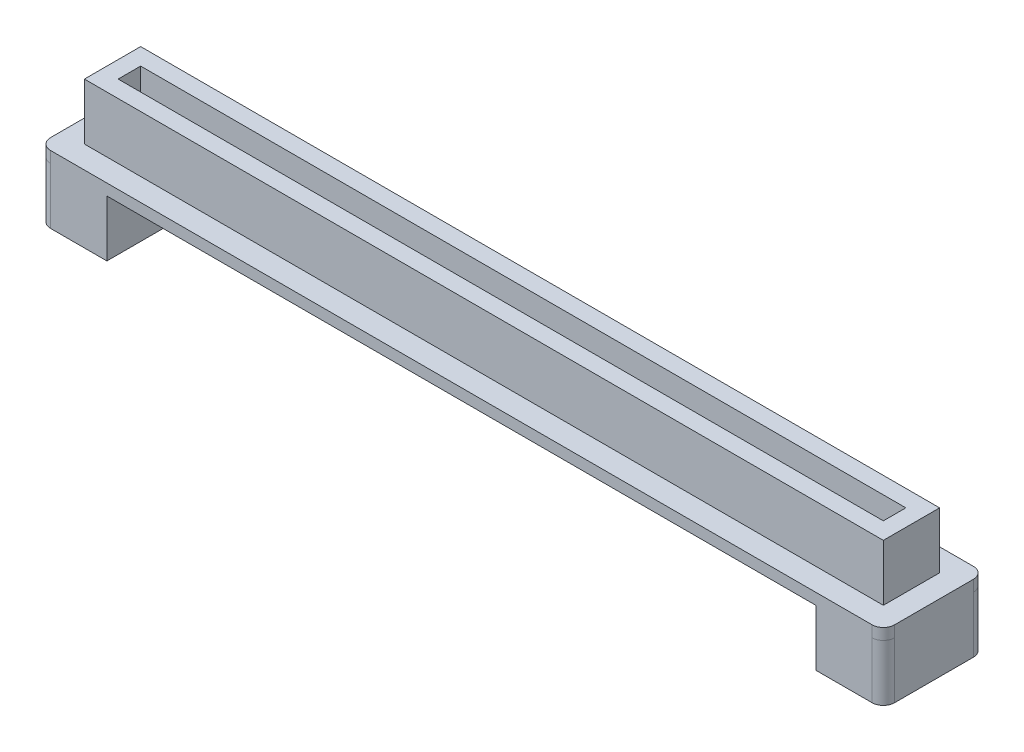
ISO-10303-21;
HEADER;
FILE_DESCRIPTION(('STEP AP214'),'2;1');
FILE_NAME('part.step','',(''),(''),'','','');
FILE_SCHEMA(('AUTOMOTIVE_DESIGN { 1 0 10303 214 1 1 1 1 }'));
ENDSEC;
DATA;
#1=APPLICATION_CONTEXT('core data for automotive mechanical design processes');
#2=APPLICATION_PROTOCOL_DEFINITION('international standard','automotive_design',2000,#1);
#3=PRODUCT_CONTEXT('',#1,'mechanical');
#4=PRODUCT('Part','Part','',(#3));
#5=PRODUCT_RELATED_PRODUCT_CATEGORY('part','',(#4));
#6=PRODUCT_DEFINITION_FORMATION('','',#4);
#7=PRODUCT_DEFINITION_CONTEXT('part definition',#1,'design');
#8=PRODUCT_DEFINITION('design','',#6,#7);
#9=PRODUCT_DEFINITION_SHAPE('','',#8);
#10=(LENGTH_UNIT() NAMED_UNIT(*) SI_UNIT(.MILLI.,.METRE.));
#11=(NAMED_UNIT(*) PLANE_ANGLE_UNIT() SI_UNIT($,.RADIAN.));
#12=(NAMED_UNIT(*) SI_UNIT($,.STERADIAN.) SOLID_ANGLE_UNIT());
#13=UNCERTAINTY_MEASURE_WITH_UNIT(LENGTH_MEASURE(1.E-05),#10,'distance_accuracy_value','');
#14=(GEOMETRIC_REPRESENTATION_CONTEXT(3) GLOBAL_UNCERTAINTY_ASSIGNED_CONTEXT((#13)) GLOBAL_UNIT_ASSIGNED_CONTEXT((#10,
#11,#12)) REPRESENTATION_CONTEXT('',''));
#15=CARTESIAN_POINT('',(0.,0.,0.));
#16=DIRECTION('',(0.,0.,1.));
#17=DIRECTION('',(1.,0.,0.));
#18=AXIS2_PLACEMENT_3D('',#15,#16,#17);
#19=CARTESIAN_POINT('',(0.,0.,0.));
#20=DIRECTION('',(0.,-1.,0.));
#21=DIRECTION('',(0.,0.,-1.));
#22=AXIS2_PLACEMENT_3D('',#19,#20,#21);
#23=PLANE('',#22);
#24=DIRECTION('',(-1.,0.,0.));
#25=VECTOR('',#24,1.);
#26=CARTESIAN_POINT('',(0.,0.,-9.));
#27=LINE('',#26,#25);
#28=CARTESIAN_POINT('',(69.,0.,-9.));
#29=VERTEX_POINT('',#28);
#30=CARTESIAN_POINT('',(6.,0.,-9.));
#31=VERTEX_POINT('',#30);
#32=EDGE_CURVE('E358',#29,#31,#27,.T.);
#33=ORIENTED_EDGE('',*,*,#32,.F.);
#34=DIRECTION('',(0.,0.,-1.));
#35=VECTOR('',#34,1.);
#36=CARTESIAN_POINT('',(69.,0.,-9.));
#37=LINE('',#36,#35);
#38=CARTESIAN_POINT('',(69.,0.,0.));
#39=VERTEX_POINT('',#38);
#40=EDGE_CURVE('E229',#39,#29,#37,.T.);
#41=ORIENTED_EDGE('',*,*,#40,.F.);
#42=DIRECTION('',(1.,0.,0.));
#43=VECTOR('',#42,1.);
#44=CARTESIAN_POINT('',(0.,0.,0.));
#45=LINE('',#44,#43);
#46=CARTESIAN_POINT('',(6.,0.,0.));
#47=VERTEX_POINT('',#46);
#48=EDGE_CURVE('E352',#47,#39,#45,.T.);
#49=ORIENTED_EDGE('',*,*,#48,.F.);
#50=DIRECTION('',(0.,0.,1.));
#51=VECTOR('',#50,1.);
#52=CARTESIAN_POINT('',(6.,0.,-9.));
#53=LINE('',#52,#51);
#54=EDGE_CURVE('E233',#31,#47,#53,.T.);
#55=ORIENTED_EDGE('',*,*,#54,.F.);
#56=EDGE_LOOP('',(#33,#41,#49,#55));
#57=FACE_BOUND('',#56,.T.);
#58=ADVANCED_FACE('F43',(#57),#23,.T.);
#59=CARTESIAN_POINT('',(0.,1.,0.));
#60=DIRECTION('',(0.,-1.,0.));
#61=DIRECTION('',(0.,0.,-1.));
#62=AXIS2_PLACEMENT_3D('',#59,#60,#61);
#63=PLANE('',#62);
#64=DIRECTION('',(0.,0.,-1.));
#65=VECTOR('',#64,1.);
#66=CARTESIAN_POINT('',(75.,1.,0.));
#67=LINE('',#66,#65);
#68=CARTESIAN_POINT('',(75.,1.,-1.));
#69=VERTEX_POINT('',#68);
#70=CARTESIAN_POINT('',(75.,1.,-8.));
#71=VERTEX_POINT('',#70);
#72=EDGE_CURVE('E362',#69,#71,#67,.T.);
#73=ORIENTED_EDGE('',*,*,#72,.T.);
#74=CARTESIAN_POINT('',(74.,1.,-8.));
#75=DIRECTION('',(0.,-1.,0.));
#76=DIRECTION('',(0.,0.,-1.));
#77=AXIS2_PLACEMENT_3D('',#74,#75,#76);
#78=CIRCLE('',#77,1.);
#79=CARTESIAN_POINT('',(74.,1.,-9.));
#80=VERTEX_POINT('',#79);
#81=EDGE_CURVE('E409',#71,#80,#78,.F.);
#82=ORIENTED_EDGE('',*,*,#81,.T.);
#83=DIRECTION('',(-1.,0.,0.));
#84=VECTOR('',#83,1.);
#85=CARTESIAN_POINT('',(0.,1.,-9.));
#86=LINE('',#85,#84);
#87=CARTESIAN_POINT('',(1.,1.,-9.));
#88=VERTEX_POINT('',#87);
#89=EDGE_CURVE('E366',#80,#88,#86,.T.);
#90=ORIENTED_EDGE('',*,*,#89,.T.);
#91=CARTESIAN_POINT('',(1.,1.,-8.));
#92=DIRECTION('',(0.,-1.,0.));
#93=DIRECTION('',(0.,0.,-1.));
#94=AXIS2_PLACEMENT_3D('',#91,#92,#93);
#95=CIRCLE('',#94,1.);
#96=CARTESIAN_POINT('',(0.,1.,-8.));
#97=VERTEX_POINT('',#96);
#98=EDGE_CURVE('E400',#88,#97,#95,.F.);
#99=ORIENTED_EDGE('',*,*,#98,.T.);
#100=DIRECTION('',(0.,0.,1.));
#101=VECTOR('',#100,1.);
#102=CARTESIAN_POINT('',(0.,1.,0.));
#103=LINE('',#102,#101);
#104=CARTESIAN_POINT('',(0.,1.,-1.));
#105=VERTEX_POINT('',#104);
#106=EDGE_CURVE('E353',#97,#105,#103,.T.);
#107=ORIENTED_EDGE('',*,*,#106,.T.);
#108=CARTESIAN_POINT('',(1.,1.,-1.));
#109=DIRECTION('',(0.,-1.,0.));
#110=DIRECTION('',(0.,0.,-1.));
#111=AXIS2_PLACEMENT_3D('',#108,#109,#110);
#112=CIRCLE('',#111,1.);
#113=CARTESIAN_POINT('',(1.,1.,0.));
#114=VERTEX_POINT('',#113);
#115=EDGE_CURVE('E403',#105,#114,#112,.F.);
#116=ORIENTED_EDGE('',*,*,#115,.T.);
#117=DIRECTION('',(1.,0.,0.));
#118=VECTOR('',#117,1.);
#119=CARTESIAN_POINT('',(0.,1.,0.));
#120=LINE('',#119,#118);
#121=CARTESIAN_POINT('',(74.,1.,0.));
#122=VERTEX_POINT('',#121);
#123=EDGE_CURVE('E357',#114,#122,#120,.T.);
#124=ORIENTED_EDGE('',*,*,#123,.T.);
#125=CARTESIAN_POINT('',(74.,1.,-1.));
#126=DIRECTION('',(0.,-1.,0.));
#127=DIRECTION('',(0.,0.,-1.));
#128=AXIS2_PLACEMENT_3D('',#125,#126,#127);
#129=CIRCLE('',#128,1.);
#130=EDGE_CURVE('E406',#122,#69,#129,.F.);
#131=ORIENTED_EDGE('',*,*,#130,.T.);
#132=EDGE_LOOP('',(#73,#82,#90,#99,#107,#116,#124,#131));
#133=FACE_BOUND('',#132,.T.);
#134=DIRECTION('',(0.,0.,1.));
#135=VECTOR('',#134,1.);
#136=CARTESIAN_POINT('',(2.,1.,0.));
#137=LINE('',#136,#135);
#138=CARTESIAN_POINT('',(2.,1.,-7.));
#139=VERTEX_POINT('',#138);
#140=CARTESIAN_POINT('',(2.,1.,-2.));
#141=VERTEX_POINT('',#140);
#142=EDGE_CURVE('E348',#139,#141,#137,.T.);
#143=ORIENTED_EDGE('',*,*,#142,.F.);
#144=DIRECTION('',(-1.,0.,0.));
#145=VECTOR('',#144,1.);
#146=CARTESIAN_POINT('',(0.,1.,-7.));
#147=LINE('',#146,#145);
#148=CARTESIAN_POINT('',(73.,1.,-7.));
#149=VERTEX_POINT('',#148);
#150=EDGE_CURVE('E336',#149,#139,#147,.T.);
#151=ORIENTED_EDGE('',*,*,#150,.F.);
#152=DIRECTION('',(0.,0.,-1.));
#153=VECTOR('',#152,1.);
#154=CARTESIAN_POINT('',(73.,1.,0.));
#155=LINE('',#154,#153);
#156=CARTESIAN_POINT('',(73.,1.,-2.));
#157=VERTEX_POINT('',#156);
#158=EDGE_CURVE('E340',#157,#149,#155,.T.);
#159=ORIENTED_EDGE('',*,*,#158,.F.);
#160=DIRECTION('',(1.,0.,0.));
#161=VECTOR('',#160,1.);
#162=CARTESIAN_POINT('',(0.,1.,-2.));
#163=LINE('',#162,#161);
#164=EDGE_CURVE('E344',#141,#157,#163,.T.);
#165=ORIENTED_EDGE('',*,*,#164,.F.);
#166=EDGE_LOOP('',(#143,#151,#159,#165));
#167=FACE_BOUND('',#166,.T.);
#168=ADVANCED_FACE('F474',(#133,#167),#63,.F.);
#169=CARTESIAN_POINT('',(0.,1.,0.));
#170=DIRECTION('',(1.,0.,0.));
#171=DIRECTION('',(0.,0.,-1.));
#172=AXIS2_PLACEMENT_3D('',#169,#170,#171);
#173=PLANE('',#172);
#174=DIRECTION('',(0.,0.,-1.));
#175=VECTOR('',#174,1.);
#176=CARTESIAN_POINT('',(0.,-5.,-9.));
#177=LINE('',#176,#175);
#178=CARTESIAN_POINT('',(0.,-5.,-0.999999999999999));
#179=VERTEX_POINT('',#178);
#180=CARTESIAN_POINT('',(0.,-5.,-8.));
#181=VERTEX_POINT('',#180);
#182=EDGE_CURVE('E239',#179,#181,#177,.T.);
#183=ORIENTED_EDGE('',*,*,#182,.F.);
#184=DIRECTION('',(0.,1.,0.));
#185=VECTOR('',#184,1.);
#186=CARTESIAN_POINT('',(0.,1.,-1.));
#187=LINE('',#186,#185);
#188=CARTESIAN_POINT('',(0.,0.,-1.));
#189=VERTEX_POINT('',#188);
#190=EDGE_CURVE('E453',#179,#189,#187,.T.);
#191=ORIENTED_EDGE('',*,*,#190,.T.);
#192=DIRECTION('',(0.,-1.,0.));
#193=VECTOR('',#192,1.);
#194=CARTESIAN_POINT('',(0.,1.,-1.));
#195=LINE('',#194,#193);
#196=EDGE_CURVE('E422',#189,#105,#195,.F.);
#197=ORIENTED_EDGE('',*,*,#196,.T.);
#198=ORIENTED_EDGE('',*,*,#106,.F.);
#199=DIRECTION('',(0.,-1.,0.));
#200=VECTOR('',#199,1.);
#201=CARTESIAN_POINT('',(0.,1.,-8.));
#202=LINE('',#201,#200);
#203=CARTESIAN_POINT('',(0.,0.,-8.));
#204=VERTEX_POINT('',#203);
#205=EDGE_CURVE('E419',#97,#204,#202,.T.);
#206=ORIENTED_EDGE('',*,*,#205,.T.);
#207=DIRECTION('',(0.,1.,0.));
#208=VECTOR('',#207,1.);
#209=CARTESIAN_POINT('',(0.,1.,-8.));
#210=LINE('',#209,#208);
#211=EDGE_CURVE('E59',#204,#181,#210,.F.);
#212=ORIENTED_EDGE('',*,*,#211,.T.);
#213=EDGE_LOOP('',(#183,#191,#197,#198,#206,#212));
#214=FACE_BOUND('',#213,.T.);
#215=ADVANCED_FACE('F470',(#214),#173,.F.);
#216=CARTESIAN_POINT('',(0.,1.,0.));
#217=DIRECTION('',(0.,0.,-1.));
#218=DIRECTION('',(-1.,0.,0.));
#219=AXIS2_PLACEMENT_3D('',#216,#217,#218);
#220=PLANE('',#219);
#221=DIRECTION('',(-1.,0.,0.));
#222=VECTOR('',#221,1.);
#223=CARTESIAN_POINT('',(69.,-5.,0.));
#224=LINE('',#223,#222);
#225=CARTESIAN_POINT('',(74.,-5.,0.));
#226=VERTEX_POINT('',#225);
#227=CARTESIAN_POINT('',(69.,-5.,0.));
#228=VERTEX_POINT('',#227);
#229=EDGE_CURVE('E224',#226,#228,#224,.T.);
#230=ORIENTED_EDGE('',*,*,#229,.F.);
#231=DIRECTION('',(0.,1.,0.));
#232=VECTOR('',#231,1.);
#233=CARTESIAN_POINT('',(74.,1.,0.));
#234=LINE('',#233,#232);
#235=CARTESIAN_POINT('',(74.,0.,0.));
#236=VERTEX_POINT('',#235);
#237=EDGE_CURVE('E428',#226,#236,#234,.T.);
#238=ORIENTED_EDGE('',*,*,#237,.T.);
#239=DIRECTION('',(0.,-1.,0.));
#240=VECTOR('',#239,1.);
#241=CARTESIAN_POINT('',(74.,1.,0.));
#242=LINE('',#241,#240);
#243=EDGE_CURVE('E416',#236,#122,#242,.F.);
#244=ORIENTED_EDGE('',*,*,#243,.T.);
#245=ORIENTED_EDGE('',*,*,#123,.F.);
#246=DIRECTION('',(0.,-1.,0.));
#247=VECTOR('',#246,1.);
#248=CARTESIAN_POINT('',(1.,1.,0.));
#249=LINE('',#248,#247);
#250=CARTESIAN_POINT('',(1.,0.,0.));
#251=VERTEX_POINT('',#250);
#252=EDGE_CURVE('E412',#114,#251,#249,.T.);
#253=ORIENTED_EDGE('',*,*,#252,.T.);
#254=DIRECTION('',(0.,1.,0.));
#255=VECTOR('',#254,1.);
#256=CARTESIAN_POINT('',(1.,1.,0.));
#257=LINE('',#256,#255);
#258=CARTESIAN_POINT('',(1.,-5.,0.));
#259=VERTEX_POINT('',#258);
#260=EDGE_CURVE('E425',#251,#259,#257,.F.);
#261=ORIENTED_EDGE('',*,*,#260,.T.);
#262=DIRECTION('',(-1.,0.,0.));
#263=VECTOR('',#262,1.);
#264=CARTESIAN_POINT('',(0.,-5.,0.));
#265=LINE('',#264,#263);
#266=CARTESIAN_POINT('',(6.,-5.,0.));
#267=VERTEX_POINT('',#266);
#268=EDGE_CURVE('E252',#267,#259,#265,.T.);
#269=ORIENTED_EDGE('',*,*,#268,.F.);
#270=DIRECTION('',(0.,1.,0.));
#271=VECTOR('',#270,1.);
#272=CARTESIAN_POINT('',(6.,-5.,0.));
#273=LINE('',#272,#271);
#274=EDGE_CURVE('E254',#267,#47,#273,.T.);
#275=ORIENTED_EDGE('',*,*,#274,.T.);
#276=ORIENTED_EDGE('',*,*,#48,.T.);
#277=DIRECTION('',(0.,1.,0.));
#278=VECTOR('',#277,1.);
#279=CARTESIAN_POINT('',(69.,-5.,0.));
#280=LINE('',#279,#278);
#281=EDGE_CURVE('E234',#228,#39,#280,.T.);
#282=ORIENTED_EDGE('',*,*,#281,.F.);
#283=EDGE_LOOP('',(#230,#238,#244,#245,#253,#261,#269,#275,#276,#282));
#284=FACE_BOUND('',#283,.T.);
#285=ADVANCED_FACE('F482',(#284),#220,.F.);
#286=CARTESIAN_POINT('',(75.,1.,0.));
#287=DIRECTION('',(-1.,0.,0.));
#288=DIRECTION('',(0.,0.,1.));
#289=AXIS2_PLACEMENT_3D('',#286,#287,#288);
#290=PLANE('',#289);
#291=DIRECTION('',(0.,-1.,0.));
#292=VECTOR('',#291,1.);
#293=CARTESIAN_POINT('',(75.,1.,-1.));
#294=LINE('',#293,#292);
#295=CARTESIAN_POINT('',(75.,0.,-1.));
#296=VERTEX_POINT('',#295);
#297=EDGE_CURVE('E393',#69,#296,#294,.T.);
#298=ORIENTED_EDGE('',*,*,#297,.T.);
#299=DIRECTION('',(0.,1.,0.));
#300=VECTOR('',#299,1.);
#301=CARTESIAN_POINT('',(75.,1.,-1.));
#302=LINE('',#301,#300);
#303=CARTESIAN_POINT('',(75.,-5.,-0.999999999999999));
#304=VERTEX_POINT('',#303);
#305=EDGE_CURVE('E436',#296,#304,#302,.F.);
#306=ORIENTED_EDGE('',*,*,#305,.T.);
#307=DIRECTION('',(0.,0.,1.));
#308=VECTOR('',#307,1.);
#309=CARTESIAN_POINT('',(75.,-5.,-9.));
#310=LINE('',#309,#308);
#311=CARTESIAN_POINT('',(75.,-5.,-8.));
#312=VERTEX_POINT('',#311);
#313=EDGE_CURVE('E217',#312,#304,#310,.T.);
#314=ORIENTED_EDGE('',*,*,#313,.F.);
#315=DIRECTION('',(0.,1.,0.));
#316=VECTOR('',#315,1.);
#317=CARTESIAN_POINT('',(75.,1.,-8.));
#318=LINE('',#317,#316);
#319=CARTESIAN_POINT('',(75.,0.,-8.));
#320=VERTEX_POINT('',#319);
#321=EDGE_CURVE('E432',#312,#320,#318,.T.);
#322=ORIENTED_EDGE('',*,*,#321,.T.);
#323=DIRECTION('',(0.,-1.,0.));
#324=VECTOR('',#323,1.);
#325=CARTESIAN_POINT('',(75.,1.,-8.));
#326=LINE('',#325,#324);
#327=EDGE_CURVE('E397',#320,#71,#326,.F.);
#328=ORIENTED_EDGE('',*,*,#327,.T.);
#329=ORIENTED_EDGE('',*,*,#72,.F.);
#330=EDGE_LOOP('',(#298,#306,#314,#322,#328,#329));
#331=FACE_BOUND('',#330,.T.);
#332=ADVANCED_FACE('F508',(#331),#290,.F.);
#333=CARTESIAN_POINT('',(0.,1.,-9.));
#334=DIRECTION('',(0.,0.,1.));
#335=DIRECTION('',(1.,0.,0.));
#336=AXIS2_PLACEMENT_3D('',#333,#334,#335);
#337=PLANE('',#336);
#338=DIRECTION('',(0.,-1.,0.));
#339=VECTOR('',#338,1.);
#340=CARTESIAN_POINT('',(74.,1.,-9.));
#341=LINE('',#340,#339);
#342=CARTESIAN_POINT('',(74.,0.,-9.));
#343=VERTEX_POINT('',#342);
#344=EDGE_CURVE('E378',#80,#343,#341,.T.);
#345=ORIENTED_EDGE('',*,*,#344,.T.);
#346=DIRECTION('',(0.,1.,0.));
#347=VECTOR('',#346,1.);
#348=CARTESIAN_POINT('',(74.,1.,-9.));
#349=LINE('',#348,#347);
#350=CARTESIAN_POINT('',(74.,-5.,-9.));
#351=VERTEX_POINT('',#350);
#352=EDGE_CURVE('E213',#343,#351,#349,.F.);
#353=ORIENTED_EDGE('',*,*,#352,.T.);
#354=DIRECTION('',(1.,0.,0.));
#355=VECTOR('',#354,1.);
#356=CARTESIAN_POINT('',(69.,-5.,-9.));
#357=LINE('',#356,#355);
#358=CARTESIAN_POINT('',(69.,-5.,-9.));
#359=VERTEX_POINT('',#358);
#360=EDGE_CURVE('E205',#359,#351,#357,.T.);
#361=ORIENTED_EDGE('',*,*,#360,.F.);
#362=DIRECTION('',(0.,1.,0.));
#363=VECTOR('',#362,1.);
#364=CARTESIAN_POINT('',(69.,-5.,-9.));
#365=LINE('',#364,#363);
#366=EDGE_CURVE('E210',#359,#29,#365,.T.);
#367=ORIENTED_EDGE('',*,*,#366,.T.);
#368=ORIENTED_EDGE('',*,*,#32,.T.);
#369=DIRECTION('',(0.,1.,0.));
#370=VECTOR('',#369,1.);
#371=CARTESIAN_POINT('',(6.,-5.,-9.));
#372=LINE('',#371,#370);
#373=CARTESIAN_POINT('',(6.,-5.,-9.));
#374=VERTEX_POINT('',#373);
#375=EDGE_CURVE('E259',#374,#31,#372,.T.);
#376=ORIENTED_EDGE('',*,*,#375,.F.);
#377=DIRECTION('',(1.,0.,0.));
#378=VECTOR('',#377,1.);
#379=CARTESIAN_POINT('',(0.,-5.,-9.));
#380=LINE('',#379,#378);
#381=CARTESIAN_POINT('',(1.,-5.,-9.));
#382=VERTEX_POINT('',#381);
#383=EDGE_CURVE('E246',#382,#374,#380,.T.);
#384=ORIENTED_EDGE('',*,*,#383,.F.);
#385=DIRECTION('',(0.,1.,0.));
#386=VECTOR('',#385,1.);
#387=CARTESIAN_POINT('',(1.,1.,-9.));
#388=LINE('',#387,#386);
#389=CARTESIAN_POINT('',(1.,0.,-9.));
#390=VERTEX_POINT('',#389);
#391=EDGE_CURVE('E445',#382,#390,#388,.T.);
#392=ORIENTED_EDGE('',*,*,#391,.T.);
#393=DIRECTION('',(0.,-1.,0.));
#394=VECTOR('',#393,1.);
#395=CARTESIAN_POINT('',(1.,1.,-9.));
#396=LINE('',#395,#394);
#397=EDGE_CURVE('E370',#390,#88,#396,.F.);
#398=ORIENTED_EDGE('',*,*,#397,.T.);
#399=ORIENTED_EDGE('',*,*,#89,.F.);
#400=EDGE_LOOP('',(#345,#353,#361,#367,#368,#376,#384,#392,#398,#399));
#401=FACE_BOUND('',#400,.T.);
#402=ADVANCED_FACE('F208',(#401),#337,.F.);
#403=CARTESIAN_POINT('',(74.,1.,-8.));
#404=DIRECTION('',(0.,-1.,0.));
#405=DIRECTION('',(0.,0.,-1.));
#406=AXIS2_PLACEMENT_3D('',#403,#404,#405);
#407=CYLINDRICAL_SURFACE('',#406,1.);
#408=ORIENTED_EDGE('',*,*,#81,.F.);
#409=ORIENTED_EDGE('',*,*,#327,.F.);
#410=CARTESIAN_POINT('',(74.,0.,-8.));
#411=DIRECTION('',(0.,-1.,0.));
#412=DIRECTION('',(0.,0.,-1.));
#413=AXIS2_PLACEMENT_3D('',#410,#411,#412);
#414=CIRCLE('',#413,1.);
#415=EDGE_CURVE('E390',#343,#320,#414,.T.);
#416=ORIENTED_EDGE('',*,*,#415,.F.);
#417=ORIENTED_EDGE('',*,*,#344,.F.);
#418=EDGE_LOOP('',(#408,#409,#416,#417));
#419=FACE_BOUND('',#418,.T.);
#420=ADVANCED_FACE('F507',(#419),#407,.T.);
#421=CARTESIAN_POINT('',(74.,1.,-1.));
#422=DIRECTION('',(0.,-1.,0.));
#423=DIRECTION('',(0.,0.,-1.));
#424=AXIS2_PLACEMENT_3D('',#421,#422,#423);
#425=CYLINDRICAL_SURFACE('',#424,1.);
#426=ORIENTED_EDGE('',*,*,#130,.F.);
#427=ORIENTED_EDGE('',*,*,#243,.F.);
#428=CARTESIAN_POINT('',(74.,0.,-1.));
#429=DIRECTION('',(0.,-1.,0.));
#430=DIRECTION('',(0.,0.,-1.));
#431=AXIS2_PLACEMENT_3D('',#428,#429,#430);
#432=CIRCLE('',#431,1.);
#433=EDGE_CURVE('E387',#296,#236,#432,.T.);
#434=ORIENTED_EDGE('',*,*,#433,.F.);
#435=ORIENTED_EDGE('',*,*,#297,.F.);
#436=EDGE_LOOP('',(#426,#427,#434,#435));
#437=FACE_BOUND('',#436,.T.);
#438=ADVANCED_FACE('F518',(#437),#425,.T.);
#439=CARTESIAN_POINT('',(1.,1.,-1.));
#440=DIRECTION('',(0.,-1.,0.));
#441=DIRECTION('',(0.,0.,-1.));
#442=AXIS2_PLACEMENT_3D('',#439,#440,#441);
#443=CYLINDRICAL_SURFACE('',#442,1.);
#444=ORIENTED_EDGE('',*,*,#115,.F.);
#445=ORIENTED_EDGE('',*,*,#196,.F.);
#446=CARTESIAN_POINT('',(1.,0.,-1.));
#447=DIRECTION('',(0.,-1.,0.));
#448=DIRECTION('',(0.,0.,-1.));
#449=AXIS2_PLACEMENT_3D('',#446,#447,#448);
#450=CIRCLE('',#449,1.);
#451=EDGE_CURVE('E384',#251,#189,#450,.T.);
#452=ORIENTED_EDGE('',*,*,#451,.F.);
#453=ORIENTED_EDGE('',*,*,#252,.F.);
#454=EDGE_LOOP('',(#444,#445,#452,#453));
#455=FACE_BOUND('',#454,.T.);
#456=ADVANCED_FACE('F479',(#455),#443,.T.);
#457=CARTESIAN_POINT('',(1.,1.,-8.));
#458=DIRECTION('',(0.,-1.,0.));
#459=DIRECTION('',(0.,0.,-1.));
#460=AXIS2_PLACEMENT_3D('',#457,#458,#459);
#461=CYLINDRICAL_SURFACE('',#460,1.);
#462=ORIENTED_EDGE('',*,*,#98,.F.);
#463=ORIENTED_EDGE('',*,*,#397,.F.);
#464=CARTESIAN_POINT('',(1.,0.,-8.));
#465=DIRECTION('',(0.,-1.,0.));
#466=DIRECTION('',(0.,0.,-1.));
#467=AXIS2_PLACEMENT_3D('',#464,#465,#466);
#468=CIRCLE('',#467,1.);
#469=EDGE_CURVE('E381',#204,#390,#468,.T.);
#470=ORIENTED_EDGE('',*,*,#469,.F.);
#471=ORIENTED_EDGE('',*,*,#205,.F.);
#472=EDGE_LOOP('',(#462,#463,#470,#471));
#473=FACE_BOUND('',#472,.T.);
#474=ADVANCED_FACE('F468',(#473),#461,.T.);
#475=CARTESIAN_POINT('',(2.,6.,-7.));
#476=DIRECTION('',(1.,0.,0.));
#477=DIRECTION('',(0.,0.,-1.));
#478=AXIS2_PLACEMENT_3D('',#475,#476,#477);
#479=PLANE('',#478);
#480=DIRECTION('',(0.,-1.,0.));
#481=VECTOR('',#480,1.);
#482=CARTESIAN_POINT('',(2.,6.,-7.));
#483=LINE('',#482,#481);
#484=CARTESIAN_POINT('',(2.,6.,-7.));
#485=VERTEX_POINT('',#484);
#486=EDGE_CURVE('E320',#485,#139,#483,.T.);
#487=ORIENTED_EDGE('',*,*,#486,.T.);
#488=ORIENTED_EDGE('',*,*,#142,.T.);
#489=DIRECTION('',(0.,-1.,0.));
#490=VECTOR('',#489,1.);
#491=CARTESIAN_POINT('',(2.,6.,-2.));
#492=LINE('',#491,#490);
#493=CARTESIAN_POINT('',(2.,6.,-2.));
#494=VERTEX_POINT('',#493);
#495=EDGE_CURVE('E332',#494,#141,#492,.T.);
#496=ORIENTED_EDGE('',*,*,#495,.F.);
#497=DIRECTION('',(0.,0.,1.));
#498=VECTOR('',#497,1.);
#499=CARTESIAN_POINT('',(2.,6.,-7.));
#500=LINE('',#499,#498);
#501=EDGE_CURVE('E307',#485,#494,#500,.T.);
#502=ORIENTED_EDGE('',*,*,#501,.F.);
#503=EDGE_LOOP('',(#487,#488,#496,#502));
#504=FACE_BOUND('',#503,.T.);
#505=ADVANCED_FACE('F527',(#504),#479,.F.);
#506=CARTESIAN_POINT('',(2.,6.,-2.));
#507=DIRECTION('',(0.,0.,-1.));
#508=DIRECTION('',(-1.,0.,0.));
#509=AXIS2_PLACEMENT_3D('',#506,#507,#508);
#510=PLANE('',#509);
#511=ORIENTED_EDGE('',*,*,#495,.T.);
#512=ORIENTED_EDGE('',*,*,#164,.T.);
#513=DIRECTION('',(0.,-1.,0.));
#514=VECTOR('',#513,1.);
#515=CARTESIAN_POINT('',(73.,6.,-2.));
#516=LINE('',#515,#514);
#517=CARTESIAN_POINT('',(73.,6.,-2.));
#518=VERTEX_POINT('',#517);
#519=EDGE_CURVE('E328',#518,#157,#516,.T.);
#520=ORIENTED_EDGE('',*,*,#519,.F.);
#521=DIRECTION('',(1.,0.,0.));
#522=VECTOR('',#521,1.);
#523=CARTESIAN_POINT('',(2.,6.,-2.));
#524=LINE('',#523,#522);
#525=EDGE_CURVE('E311',#494,#518,#524,.T.);
#526=ORIENTED_EDGE('',*,*,#525,.F.);
#527=EDGE_LOOP('',(#511,#512,#520,#526));
#528=FACE_BOUND('',#527,.T.);
#529=ADVANCED_FACE('F587',(#528),#510,.F.);
#530=CARTESIAN_POINT('',(73.,6.,-7.));
#531=DIRECTION('',(-1.,0.,0.));
#532=DIRECTION('',(0.,0.,1.));
#533=AXIS2_PLACEMENT_3D('',#530,#531,#532);
#534=PLANE('',#533);
#535=ORIENTED_EDGE('',*,*,#519,.T.);
#536=ORIENTED_EDGE('',*,*,#158,.T.);
#537=DIRECTION('',(0.,-1.,0.));
#538=VECTOR('',#537,1.);
#539=CARTESIAN_POINT('',(73.,6.,-7.));
#540=LINE('',#539,#538);
#541=CARTESIAN_POINT('',(73.,6.,-7.));
#542=VERTEX_POINT('',#541);
#543=EDGE_CURVE('E324',#542,#149,#540,.T.);
#544=ORIENTED_EDGE('',*,*,#543,.F.);
#545=DIRECTION('',(0.,0.,-1.));
#546=VECTOR('',#545,1.);
#547=CARTESIAN_POINT('',(73.,6.,-7.));
#548=LINE('',#547,#546);
#549=EDGE_CURVE('E314',#518,#542,#548,.T.);
#550=ORIENTED_EDGE('',*,*,#549,.F.);
#551=EDGE_LOOP('',(#535,#536,#544,#550));
#552=FACE_BOUND('',#551,.T.);
#553=ADVANCED_FACE('F583',(#552),#534,.F.);
#554=CARTESIAN_POINT('',(2.,6.,-7.));
#555=DIRECTION('',(0.,0.,1.));
#556=DIRECTION('',(1.,0.,0.));
#557=AXIS2_PLACEMENT_3D('',#554,#555,#556);
#558=PLANE('',#557);
#559=ORIENTED_EDGE('',*,*,#543,.T.);
#560=ORIENTED_EDGE('',*,*,#150,.T.);
#561=ORIENTED_EDGE('',*,*,#486,.F.);
#562=DIRECTION('',(-1.,0.,0.));
#563=VECTOR('',#562,1.);
#564=CARTESIAN_POINT('',(2.,6.,-7.));
#565=LINE('',#564,#563);
#566=EDGE_CURVE('E317',#542,#485,#565,.T.);
#567=ORIENTED_EDGE('',*,*,#566,.F.);
#568=EDGE_LOOP('',(#559,#560,#561,#567));
#569=FACE_BOUND('',#568,.T.);
#570=ADVANCED_FACE('F579',(#569),#558,.F.);
#571=CARTESIAN_POINT('',(0.,6.,0.));
#572=DIRECTION('',(0.,1.,0.));
#573=DIRECTION('',(0.,0.,1.));
#574=AXIS2_PLACEMENT_3D('',#571,#572,#573);
#575=PLANE('',#574);
#576=DIRECTION('',(0.,0.,1.));
#577=VECTOR('',#576,1.);
#578=CARTESIAN_POINT('',(3.5,6.,-7.));
#579=LINE('',#578,#577);
#580=CARTESIAN_POINT('',(3.5,6.,-5.5));
#581=VERTEX_POINT('',#580);
#582=CARTESIAN_POINT('',(3.5,6.,-3.5));
#583=VERTEX_POINT('',#582);
#584=EDGE_CURVE('E263',#581,#583,#579,.T.);
#585=ORIENTED_EDGE('',*,*,#584,.F.);
#586=DIRECTION('',(-1.,0.,0.));
#587=VECTOR('',#586,1.);
#588=CARTESIAN_POINT('',(2.,6.,-5.5));
#589=LINE('',#588,#587);
#590=CARTESIAN_POINT('',(71.5,6.,-5.5));
#591=VERTEX_POINT('',#590);
#592=EDGE_CURVE('E269',#591,#581,#589,.T.);
#593=ORIENTED_EDGE('',*,*,#592,.F.);
#594=DIRECTION('',(0.,0.,-1.));
#595=VECTOR('',#594,1.);
#596=CARTESIAN_POINT('',(71.5,6.,-7.));
#597=LINE('',#596,#595);
#598=CARTESIAN_POINT('',(71.5,6.,-3.5));
#599=VERTEX_POINT('',#598);
#600=EDGE_CURVE('E287',#599,#591,#597,.T.);
#601=ORIENTED_EDGE('',*,*,#600,.F.);
#602=DIRECTION('',(1.,0.,0.));
#603=VECTOR('',#602,1.);
#604=CARTESIAN_POINT('',(2.,6.,-3.5));
#605=LINE('',#604,#603);
#606=EDGE_CURVE('E284',#583,#599,#605,.T.);
#607=ORIENTED_EDGE('',*,*,#606,.F.);
#608=EDGE_LOOP('',(#585,#593,#601,#607));
#609=FACE_BOUND('',#608,.T.);
#610=ORIENTED_EDGE('',*,*,#501,.T.);
#611=ORIENTED_EDGE('',*,*,#525,.T.);
#612=ORIENTED_EDGE('',*,*,#549,.T.);
#613=ORIENTED_EDGE('',*,*,#566,.T.);
#614=EDGE_LOOP('',(#610,#611,#612,#613));
#615=FACE_BOUND('',#614,.T.);
#616=ADVANCED_FACE('F569',(#609,#615),#575,.T.);
#617=CARTESIAN_POINT('',(2.,6.,-3.5));
#618=DIRECTION('',(0.,0.,-1.));
#619=DIRECTION('',(-1.,0.,0.));
#620=AXIS2_PLACEMENT_3D('',#617,#618,#619);
#621=PLANE('',#620);
#622=DIRECTION('',(0.,-1.,0.));
#623=VECTOR('',#622,1.);
#624=CARTESIAN_POINT('',(3.5,6.,-3.5));
#625=LINE('',#624,#623);
#626=CARTESIAN_POINT('',(3.5,1.5,-3.5));
#627=VERTEX_POINT('',#626);
#628=EDGE_CURVE('E270',#583,#627,#625,.T.);
#629=ORIENTED_EDGE('',*,*,#628,.F.);
#630=ORIENTED_EDGE('',*,*,#606,.T.);
#631=DIRECTION('',(0.,-1.,0.));
#632=VECTOR('',#631,1.);
#633=CARTESIAN_POINT('',(71.5,6.,-3.5));
#634=LINE('',#633,#632);
#635=CARTESIAN_POINT('',(71.5,1.5,-3.5));
#636=VERTEX_POINT('',#635);
#637=EDGE_CURVE('E275',#599,#636,#634,.T.);
#638=ORIENTED_EDGE('',*,*,#637,.T.);
#639=DIRECTION('',(1.,0.,0.));
#640=VECTOR('',#639,1.);
#641=CARTESIAN_POINT('',(0.,1.5,-3.5));
#642=LINE('',#641,#640);
#643=EDGE_CURVE('E303',#627,#636,#642,.T.);
#644=ORIENTED_EDGE('',*,*,#643,.F.);
#645=EDGE_LOOP('',(#629,#630,#638,#644));
#646=FACE_BOUND('',#645,.T.);
#647=ADVANCED_FACE('F565',(#646),#621,.T.);
#648=CARTESIAN_POINT('',(71.5,6.,-7.));
#649=DIRECTION('',(-1.,0.,0.));
#650=DIRECTION('',(0.,0.,1.));
#651=AXIS2_PLACEMENT_3D('',#648,#649,#650);
#652=PLANE('',#651);
#653=ORIENTED_EDGE('',*,*,#637,.F.);
#654=ORIENTED_EDGE('',*,*,#600,.T.);
#655=DIRECTION('',(0.,-1.,0.));
#656=VECTOR('',#655,1.);
#657=CARTESIAN_POINT('',(71.5,6.,-5.5));
#658=LINE('',#657,#656);
#659=CARTESIAN_POINT('',(71.5,1.5,-5.5));
#660=VERTEX_POINT('',#659);
#661=EDGE_CURVE('E268',#591,#660,#658,.T.);
#662=ORIENTED_EDGE('',*,*,#661,.T.);
#663=DIRECTION('',(0.,0.,-1.));
#664=VECTOR('',#663,1.);
#665=CARTESIAN_POINT('',(71.5,1.5,0.));
#666=LINE('',#665,#664);
#667=EDGE_CURVE('E299',#636,#660,#666,.T.);
#668=ORIENTED_EDGE('',*,*,#667,.F.);
#669=EDGE_LOOP('',(#653,#654,#662,#668));
#670=FACE_BOUND('',#669,.T.);
#671=ADVANCED_FACE('F568',(#670),#652,.T.);
#672=CARTESIAN_POINT('',(2.,6.,-5.5));
#673=DIRECTION('',(0.,0.,1.));
#674=DIRECTION('',(1.,0.,0.));
#675=AXIS2_PLACEMENT_3D('',#672,#673,#674);
#676=PLANE('',#675);
#677=ORIENTED_EDGE('',*,*,#661,.F.);
#678=ORIENTED_EDGE('',*,*,#592,.T.);
#679=DIRECTION('',(0.,-1.,0.));
#680=VECTOR('',#679,1.);
#681=CARTESIAN_POINT('',(3.5,6.,-5.5));
#682=LINE('',#681,#680);
#683=CARTESIAN_POINT('',(3.5,1.5,-5.5));
#684=VERTEX_POINT('',#683);
#685=EDGE_CURVE('E264',#581,#684,#682,.T.);
#686=ORIENTED_EDGE('',*,*,#685,.T.);
#687=DIRECTION('',(-1.,0.,0.));
#688=VECTOR('',#687,1.);
#689=CARTESIAN_POINT('',(0.,1.5,-5.5));
#690=LINE('',#689,#688);
#691=EDGE_CURVE('E296',#660,#684,#690,.T.);
#692=ORIENTED_EDGE('',*,*,#691,.F.);
#693=EDGE_LOOP('',(#677,#678,#686,#692));
#694=FACE_BOUND('',#693,.T.);
#695=ADVANCED_FACE('F563',(#694),#676,.T.);
#696=CARTESIAN_POINT('',(3.5,6.,-7.));
#697=DIRECTION('',(1.,0.,0.));
#698=DIRECTION('',(0.,0.,-1.));
#699=AXIS2_PLACEMENT_3D('',#696,#697,#698);
#700=PLANE('',#699);
#701=ORIENTED_EDGE('',*,*,#685,.F.);
#702=ORIENTED_EDGE('',*,*,#584,.T.);
#703=ORIENTED_EDGE('',*,*,#628,.T.);
#704=DIRECTION('',(0.,0.,1.));
#705=VECTOR('',#704,1.);
#706=CARTESIAN_POINT('',(3.5,1.5,0.));
#707=LINE('',#706,#705);
#708=EDGE_CURVE('E274',#684,#627,#707,.T.);
#709=ORIENTED_EDGE('',*,*,#708,.F.);
#710=EDGE_LOOP('',(#701,#702,#703,#709));
#711=FACE_BOUND('',#710,.T.);
#712=ADVANCED_FACE('F556',(#711),#700,.T.);
#713=CARTESIAN_POINT('',(0.,1.5,0.));
#714=DIRECTION('',(0.,-1.,0.));
#715=DIRECTION('',(0.,0.,-1.));
#716=AXIS2_PLACEMENT_3D('',#713,#714,#715);
#717=PLANE('',#716);
#718=ORIENTED_EDGE('',*,*,#643,.T.);
#719=ORIENTED_EDGE('',*,*,#667,.T.);
#720=ORIENTED_EDGE('',*,*,#691,.T.);
#721=ORIENTED_EDGE('',*,*,#708,.T.);
#722=EDGE_LOOP('',(#718,#719,#720,#721));
#723=FACE_BOUND('',#722,.T.);
#724=ADVANCED_FACE('F549',(#723),#717,.F.);
#725=CARTESIAN_POINT('',(6.,-5.,-9.));
#726=DIRECTION('',(-1.,0.,0.));
#727=DIRECTION('',(0.,0.,1.));
#728=AXIS2_PLACEMENT_3D('',#725,#726,#727);
#729=PLANE('',#728);
#730=ORIENTED_EDGE('',*,*,#54,.T.);
#731=ORIENTED_EDGE('',*,*,#274,.F.);
#732=DIRECTION('',(0.,0.,1.));
#733=VECTOR('',#732,1.);
#734=CARTESIAN_POINT('',(6.,-5.,-9.));
#735=LINE('',#734,#733);
#736=EDGE_CURVE('E249',#374,#267,#735,.T.);
#737=ORIENTED_EDGE('',*,*,#736,.F.);
#738=ORIENTED_EDGE('',*,*,#375,.T.);
#739=EDGE_LOOP('',(#730,#731,#737,#738));
#740=FACE_BOUND('',#739,.T.);
#741=ADVANCED_FACE('F547',(#740),#729,.F.);
#742=CARTESIAN_POINT('',(0.,-5.,0.));
#743=DIRECTION('',(0.,1.,0.));
#744=DIRECTION('',(0.,0.,1.));
#745=AXIS2_PLACEMENT_3D('',#742,#743,#744);
#746=PLANE('',#745);
#747=ORIENTED_EDGE('',*,*,#268,.T.);
#748=CARTESIAN_POINT('',(1.,-5.,-1.));
#749=DIRECTION('',(0.,1.,0.));
#750=DIRECTION('',(0.,0.,1.));
#751=AXIS2_PLACEMENT_3D('',#748,#749,#750);
#752=CIRCLE('',#751,1.);
#753=EDGE_CURVE('E11',#259,#179,#752,.F.);
#754=ORIENTED_EDGE('',*,*,#753,.T.);
#755=ORIENTED_EDGE('',*,*,#182,.T.);
#756=CARTESIAN_POINT('',(1.,-5.,-8.));
#757=DIRECTION('',(0.,1.,0.));
#758=DIRECTION('',(0.,0.,1.));
#759=AXIS2_PLACEMENT_3D('',#756,#757,#758);
#760=CIRCLE('',#759,1.);
#761=EDGE_CURVE('E52',#181,#382,#760,.F.);
#762=ORIENTED_EDGE('',*,*,#761,.T.);
#763=ORIENTED_EDGE('',*,*,#383,.T.);
#764=ORIENTED_EDGE('',*,*,#736,.T.);
#765=EDGE_LOOP('',(#747,#754,#755,#762,#763,#764));
#766=FACE_BOUND('',#765,.T.);
#767=ADVANCED_FACE('F459',(#766),#746,.F.);
#768=CARTESIAN_POINT('',(69.,-5.,-9.));
#769=DIRECTION('',(1.,0.,0.));
#770=DIRECTION('',(0.,0.,-1.));
#771=AXIS2_PLACEMENT_3D('',#768,#769,#770);
#772=PLANE('',#771);
#773=ORIENTED_EDGE('',*,*,#40,.T.);
#774=ORIENTED_EDGE('',*,*,#366,.F.);
#775=DIRECTION('',(0.,0.,-1.));
#776=VECTOR('',#775,1.);
#777=CARTESIAN_POINT('',(69.,-5.,-9.));
#778=LINE('',#777,#776);
#779=EDGE_CURVE('E218',#228,#359,#778,.T.);
#780=ORIENTED_EDGE('',*,*,#779,.F.);
#781=ORIENTED_EDGE('',*,*,#281,.T.);
#782=EDGE_LOOP('',(#773,#774,#780,#781));
#783=FACE_BOUND('',#782,.T.);
#784=ADVANCED_FACE('F231',(#783),#772,.F.);
#785=CARTESIAN_POINT('',(69.,-5.,0.));
#786=DIRECTION('',(0.,1.,0.));
#787=DIRECTION('',(0.,0.,1.));
#788=AXIS2_PLACEMENT_3D('',#785,#786,#787);
#789=PLANE('',#788);
#790=ORIENTED_EDGE('',*,*,#313,.T.);
#791=CARTESIAN_POINT('',(74.,-5.,-1.));
#792=DIRECTION('',(0.,1.,0.));
#793=DIRECTION('',(0.,0.,1.));
#794=AXIS2_PLACEMENT_3D('',#791,#792,#793);
#795=CIRCLE('',#794,1.);
#796=EDGE_CURVE('E442',#304,#226,#795,.F.);
#797=ORIENTED_EDGE('',*,*,#796,.T.);
#798=ORIENTED_EDGE('',*,*,#229,.T.);
#799=ORIENTED_EDGE('',*,*,#779,.T.);
#800=ORIENTED_EDGE('',*,*,#360,.T.);
#801=CARTESIAN_POINT('',(74.,-5.,-8.));
#802=DIRECTION('',(0.,1.,0.));
#803=DIRECTION('',(0.,0.,1.));
#804=AXIS2_PLACEMENT_3D('',#801,#802,#803);
#805=CIRCLE('',#804,1.);
#806=EDGE_CURVE('E439',#351,#312,#805,.F.);
#807=ORIENTED_EDGE('',*,*,#806,.T.);
#808=EDGE_LOOP('',(#790,#797,#798,#799,#800,#807));
#809=FACE_BOUND('',#808,.T.);
#810=ADVANCED_FACE('F222',(#809),#789,.F.);
#811=CARTESIAN_POINT('',(74.,1.,-1.));
#812=DIRECTION('',(0.,1.,0.));
#813=DIRECTION('',(0.,0.,1.));
#814=AXIS2_PLACEMENT_3D('',#811,#812,#813);
#815=CYLINDRICAL_SURFACE('',#814,1.);
#816=ORIENTED_EDGE('',*,*,#796,.F.);
#817=ORIENTED_EDGE('',*,*,#305,.F.);
#818=ORIENTED_EDGE('',*,*,#433,.T.);
#819=ORIENTED_EDGE('',*,*,#237,.F.);
#820=EDGE_LOOP('',(#816,#817,#818,#819));
#821=FACE_BOUND('',#820,.T.);
#822=ADVANCED_FACE('F493',(#821),#815,.T.);
#823=CARTESIAN_POINT('',(74.,1.,-8.));
#824=DIRECTION('',(0.,1.,0.));
#825=DIRECTION('',(0.,0.,1.));
#826=AXIS2_PLACEMENT_3D('',#823,#824,#825);
#827=CYLINDRICAL_SURFACE('',#826,1.);
#828=ORIENTED_EDGE('',*,*,#806,.F.);
#829=ORIENTED_EDGE('',*,*,#352,.F.);
#830=ORIENTED_EDGE('',*,*,#415,.T.);
#831=ORIENTED_EDGE('',*,*,#321,.F.);
#832=EDGE_LOOP('',(#828,#829,#830,#831));
#833=FACE_BOUND('',#832,.T.);
#834=ADVANCED_FACE('F488',(#833),#827,.T.);
#835=CARTESIAN_POINT('',(1.,1.,-1.));
#836=DIRECTION('',(0.,1.,0.));
#837=DIRECTION('',(0.,0.,1.));
#838=AXIS2_PLACEMENT_3D('',#835,#836,#837);
#839=CYLINDRICAL_SURFACE('',#838,1.);
#840=ORIENTED_EDGE('',*,*,#753,.F.);
#841=ORIENTED_EDGE('',*,*,#260,.F.);
#842=ORIENTED_EDGE('',*,*,#451,.T.);
#843=ORIENTED_EDGE('',*,*,#190,.F.);
#844=EDGE_LOOP('',(#840,#841,#842,#843));
#845=FACE_BOUND('',#844,.T.);
#846=ADVANCED_FACE('F485',(#845),#839,.T.);
#847=CARTESIAN_POINT('',(1.,1.,-8.));
#848=DIRECTION('',(0.,1.,0.));
#849=DIRECTION('',(0.,0.,1.));
#850=AXIS2_PLACEMENT_3D('',#847,#848,#849);
#851=CYLINDRICAL_SURFACE('',#850,1.);
#852=ORIENTED_EDGE('',*,*,#761,.F.);
#853=ORIENTED_EDGE('',*,*,#211,.F.);
#854=ORIENTED_EDGE('',*,*,#469,.T.);
#855=ORIENTED_EDGE('',*,*,#391,.F.);
#856=EDGE_LOOP('',(#852,#853,#854,#855));
#857=FACE_BOUND('',#856,.T.);
#858=ADVANCED_FACE('F45',(#857),#851,.T.);
#859=CLOSED_SHELL('',(#58,#168,#215,#285,#332,#402,#420,#438,#456,#474,#505,#529,#553,#570,#616,
#647,#671,#695,#712,#724,#741,#767,#784,#810,#822,#834,#846,#858));
#860=MANIFOLD_SOLID_BREP('B2',#859);
#861=ADVANCED_BREP_SHAPE_REPRESENTATION('',(#18,#860),#14);
#862=SHAPE_DEFINITION_REPRESENTATION(#9,#861);
ENDSEC;
END-ISO-10303-21;
